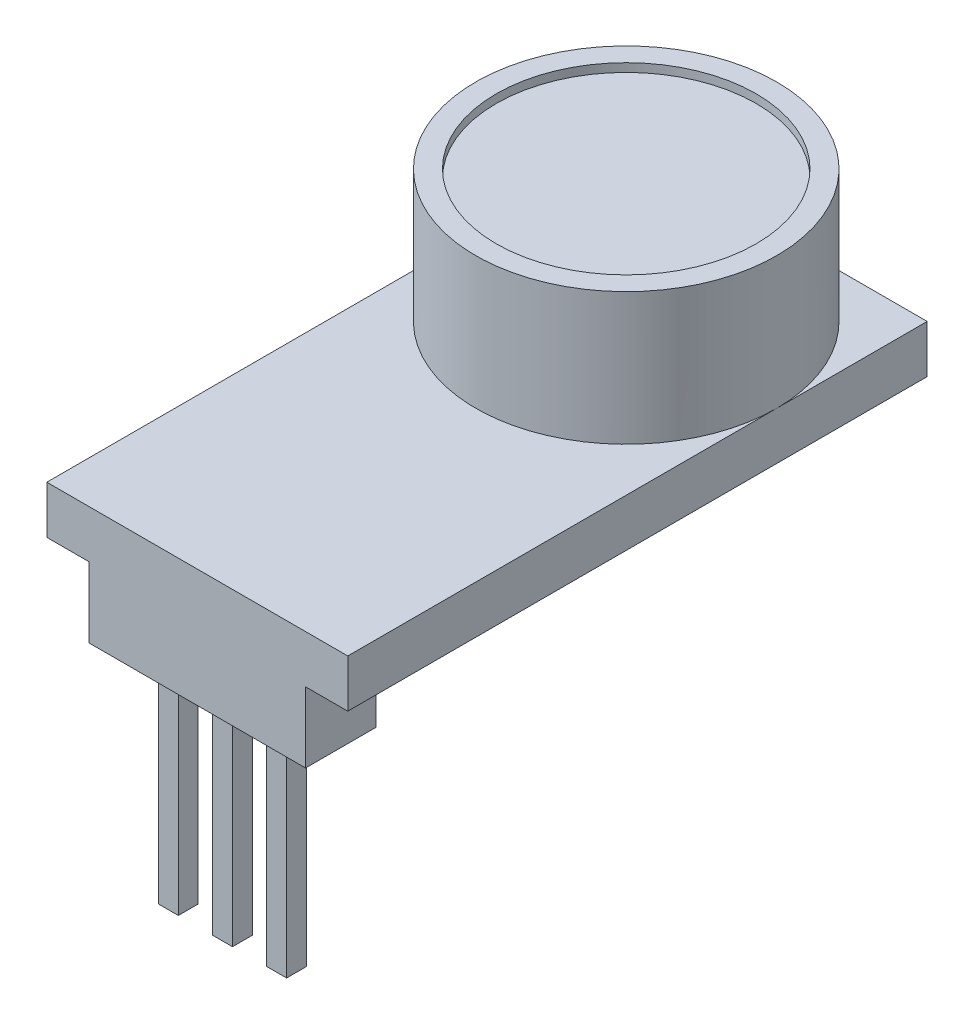
ISO-10303-21;
HEADER;
FILE_DESCRIPTION(('STEP AP214'),'2;1');
FILE_NAME('part.step','',(''),(''),'','','');
FILE_SCHEMA(('AUTOMOTIVE_DESIGN { 1 0 10303 214 1 1 1 1 }'));
ENDSEC;
DATA;
#1=APPLICATION_CONTEXT('core data for automotive mechanical design processes');
#2=APPLICATION_PROTOCOL_DEFINITION('international standard','automotive_design',2000,#1);
#3=PRODUCT_CONTEXT('',#1,'mechanical');
#4=PRODUCT('Part','Part','',(#3));
#5=PRODUCT_RELATED_PRODUCT_CATEGORY('part','',(#4));
#6=PRODUCT_DEFINITION_FORMATION('','',#4);
#7=PRODUCT_DEFINITION_CONTEXT('part definition',#1,'design');
#8=PRODUCT_DEFINITION('design','',#6,#7);
#9=PRODUCT_DEFINITION_SHAPE('','',#8);
#10=(LENGTH_UNIT() NAMED_UNIT(*) SI_UNIT(.MILLI.,.METRE.));
#11=(NAMED_UNIT(*) PLANE_ANGLE_UNIT() SI_UNIT($,.RADIAN.));
#12=(NAMED_UNIT(*) SI_UNIT($,.STERADIAN.) SOLID_ANGLE_UNIT());
#13=UNCERTAINTY_MEASURE_WITH_UNIT(LENGTH_MEASURE(1.E-05),#10,'distance_accuracy_value','');
#14=(GEOMETRIC_REPRESENTATION_CONTEXT(3) GLOBAL_UNCERTAINTY_ASSIGNED_CONTEXT((#13)) GLOBAL_UNIT_ASSIGNED_CONTEXT((#10,
#11,#12)) REPRESENTATION_CONTEXT('',''));
#15=CARTESIAN_POINT('',(0.,0.,0.));
#16=DIRECTION('',(0.,0.,1.));
#17=DIRECTION('',(1.,0.,0.));
#18=AXIS2_PLACEMENT_3D('',#15,#16,#17);
#19=CARTESIAN_POINT('',(0.,-3.35,0.));
#20=DIRECTION('',(0.,-1.,0.));
#21=DIRECTION('',(0.,0.,-1.));
#22=AXIS2_PLACEMENT_3D('',#19,#20,#21);
#23=PLANE('',#22);
#24=DIRECTION('',(0.,0.,-1.));
#25=VECTOR('',#24,1.);
#26=CARTESIAN_POINT('',(-3.85,-3.35,10.3));
#27=LINE('',#26,#25);
#28=CARTESIAN_POINT('',(-3.85,-3.35,10.3));
#29=VERTEX_POINT('',#28);
#30=CARTESIAN_POINT('',(-3.85,-3.35,7.8));
#31=VERTEX_POINT('',#30);
#32=EDGE_CURVE('E280',#29,#31,#27,.T.);
#33=ORIENTED_EDGE('',*,*,#32,.T.);
#34=DIRECTION('',(1.,0.,0.));
#35=VECTOR('',#34,1.);
#36=CARTESIAN_POINT('',(-3.85,-3.35,7.8));
#37=LINE('',#36,#35);
#38=CARTESIAN_POINT('',(3.85,-3.35,7.8));
#39=VERTEX_POINT('',#38);
#40=EDGE_CURVE('E283',#31,#39,#37,.T.);
#41=ORIENTED_EDGE('',*,*,#40,.T.);
#42=DIRECTION('',(0.,0.,1.));
#43=VECTOR('',#42,1.);
#44=CARTESIAN_POINT('',(3.85,-3.35,10.3));
#45=LINE('',#44,#43);
#46=CARTESIAN_POINT('',(3.85,-3.35,10.3));
#47=VERTEX_POINT('',#46);
#48=EDGE_CURVE('E286',#39,#47,#45,.T.);
#49=ORIENTED_EDGE('',*,*,#48,.T.);
#50=DIRECTION('',(-1.,0.,0.));
#51=VECTOR('',#50,1.);
#52=CARTESIAN_POINT('',(-3.85,-3.35,10.3));
#53=LINE('',#52,#51);
#54=EDGE_CURVE('E288',#47,#29,#53,.T.);
#55=ORIENTED_EDGE('',*,*,#54,.T.);
#56=EDGE_LOOP('',(#33,#41,#49,#55));
#57=FACE_BOUND('',#56,.T.);
#58=DIRECTION('',(-1.,0.,0.));
#59=VECTOR('',#58,1.);
#60=CARTESIAN_POINT('',(-2.27855339059327,-3.35,9.40355339059327));
#61=LINE('',#60,#59);
#62=CARTESIAN_POINT('',(-1.57144660940673,-3.35,9.40355339059327));
#63=VERTEX_POINT('',#62);
#64=CARTESIAN_POINT('',(-2.27855339059327,-3.35,9.40355339059327));
#65=VERTEX_POINT('',#64);
#66=EDGE_CURVE('E264',#63,#65,#61,.T.);
#67=ORIENTED_EDGE('',*,*,#66,.F.);
#68=DIRECTION('',(0.,0.,1.));
#69=VECTOR('',#68,1.);
#70=CARTESIAN_POINT('',(-1.57144660940673,-3.35,8.69644660940672));
#71=LINE('',#70,#69);
#72=CARTESIAN_POINT('',(-1.57144660940673,-3.35,8.69644660940672));
#73=VERTEX_POINT('',#72);
#74=EDGE_CURVE('E243',#73,#63,#71,.T.);
#75=ORIENTED_EDGE('',*,*,#74,.F.);
#76=DIRECTION('',(1.,0.,0.));
#77=VECTOR('',#76,1.);
#78=CARTESIAN_POINT('',(-2.27855339059327,-3.35,8.69644660940672));
#79=LINE('',#78,#77);
#80=CARTESIAN_POINT('',(-2.27855339059327,-3.35,8.69644660940672));
#81=VERTEX_POINT('',#80);
#82=EDGE_CURVE('E255',#81,#73,#79,.T.);
#83=ORIENTED_EDGE('',*,*,#82,.F.);
#84=DIRECTION('',(0.,0.,-1.));
#85=VECTOR('',#84,1.);
#86=CARTESIAN_POINT('',(-2.27855339059327,-3.35,8.69644660940672));
#87=LINE('',#86,#85);
#88=EDGE_CURVE('E266',#65,#81,#87,.T.);
#89=ORIENTED_EDGE('',*,*,#88,.F.);
#90=EDGE_LOOP('',(#67,#75,#83,#89));
#91=FACE_BOUND('',#90,.T.);
#92=DIRECTION('',(-1.,0.,0.));
#93=VECTOR('',#92,1.);
#94=CARTESIAN_POINT('',(-0.353553390593274,-3.35,9.40355339059327));
#95=LINE('',#94,#93);
#96=CARTESIAN_POINT('',(0.353553390593274,-3.35,9.40355339059327));
#97=VERTEX_POINT('',#96);
#98=CARTESIAN_POINT('',(-0.353553390593274,-3.35,9.40355339059327));
#99=VERTEX_POINT('',#98);
#100=EDGE_CURVE('E238',#97,#99,#95,.T.);
#101=ORIENTED_EDGE('',*,*,#100,.F.);
#102=DIRECTION('',(0.,0.,1.));
#103=VECTOR('',#102,1.);
#104=CARTESIAN_POINT('',(0.353553390593274,-3.35,8.69644660940672));
#105=LINE('',#104,#103);
#106=CARTESIAN_POINT('',(0.353553390593274,-3.35,8.69644660940672));
#107=VERTEX_POINT('',#106);
#108=EDGE_CURVE('E240',#107,#97,#105,.T.);
#109=ORIENTED_EDGE('',*,*,#108,.F.);
#110=DIRECTION('',(1.,0.,0.));
#111=VECTOR('',#110,1.);
#112=CARTESIAN_POINT('',(-0.353553390593274,-3.35,8.69644660940672));
#113=LINE('',#112,#111);
#114=CARTESIAN_POINT('',(-0.353553390593274,-3.35,8.69644660940672));
#115=VERTEX_POINT('',#114);
#116=EDGE_CURVE('E233',#115,#107,#113,.T.);
#117=ORIENTED_EDGE('',*,*,#116,.F.);
#118=DIRECTION('',(0.,0.,-1.));
#119=VECTOR('',#118,1.);
#120=CARTESIAN_POINT('',(-0.353553390593274,-3.35,8.69644660940672));
#121=LINE('',#120,#119);
#122=EDGE_CURVE('E235',#99,#115,#121,.T.);
#123=ORIENTED_EDGE('',*,*,#122,.F.);
#124=EDGE_LOOP('',(#101,#109,#117,#123));
#125=FACE_BOUND('',#124,.T.);
#126=DIRECTION('',(-1.,0.,0.));
#127=VECTOR('',#126,1.);
#128=CARTESIAN_POINT('',(1.57144660940673,-3.35,9.40355339059327));
#129=LINE('',#128,#127);
#130=CARTESIAN_POINT('',(2.27855339059327,-3.35,9.40355339059327));
#131=VERTEX_POINT('',#130);
#132=CARTESIAN_POINT('',(1.57144660940673,-3.35,9.40355339059327));
#133=VERTEX_POINT('',#132);
#134=EDGE_CURVE('E212',#131,#133,#129,.T.);
#135=ORIENTED_EDGE('',*,*,#134,.F.);
#136=DIRECTION('',(0.,0.,1.));
#137=VECTOR('',#136,1.);
#138=CARTESIAN_POINT('',(2.27855339059327,-3.35,8.69644660940672));
#139=LINE('',#138,#137);
#140=CARTESIAN_POINT('',(2.27855339059327,-3.35,8.69644660940672));
#141=VERTEX_POINT('',#140);
#142=EDGE_CURVE('E207',#141,#131,#139,.T.);
#143=ORIENTED_EDGE('',*,*,#142,.F.);
#144=DIRECTION('',(1.,0.,0.));
#145=VECTOR('',#144,1.);
#146=CARTESIAN_POINT('',(1.57144660940673,-3.35,8.69644660940672));
#147=LINE('',#146,#145);
#148=CARTESIAN_POINT('',(1.57144660940673,-3.35,8.69644660940672));
#149=VERTEX_POINT('',#148);
#150=EDGE_CURVE('E192',#149,#141,#147,.T.);
#151=ORIENTED_EDGE('',*,*,#150,.F.);
#152=DIRECTION('',(0.,0.,-1.));
#153=VECTOR('',#152,1.);
#154=CARTESIAN_POINT('',(1.57144660940673,-3.35,8.69644660940672));
#155=LINE('',#154,#153);
#156=EDGE_CURVE('E200',#133,#149,#155,.T.);
#157=ORIENTED_EDGE('',*,*,#156,.F.);
#158=EDGE_LOOP('',(#135,#143,#151,#157));
#159=FACE_BOUND('',#158,.T.);
#160=ADVANCED_FACE('F45',(#57,#91,#125,#159),#23,.T.);
#161=CARTESIAN_POINT('',(0.,0.85,0.));
#162=DIRECTION('',(0.,-1.,0.));
#163=DIRECTION('',(0.,0.,-1.));
#164=AXIS2_PLACEMENT_3D('',#161,#162,#163);
#165=PLANE('',#164);
#166=DIRECTION('',(-1.,0.,0.));
#167=VECTOR('',#166,1.);
#168=CARTESIAN_POINT('',(-5.35,0.85,-10.3));
#169=LINE('',#168,#167);
#170=CARTESIAN_POINT('',(5.35,0.85,-10.3));
#171=VERTEX_POINT('',#170);
#172=CARTESIAN_POINT('',(0.,0.85,-10.3));
#173=VERTEX_POINT('',#172);
#174=EDGE_CURVE('E322',#171,#173,#169,.T.);
#175=ORIENTED_EDGE('',*,*,#174,.T.);
#176=CARTESIAN_POINT('',(0.,0.85,-4.95));
#177=DIRECTION('',(0.,-1.,0.));
#178=DIRECTION('',(0.,0.,-1.));
#179=AXIS2_PLACEMENT_3D('',#176,#177,#178);
#180=CIRCLE('',#179,5.35);
#181=CARTESIAN_POINT('',(5.35,0.85,-4.95));
#182=VERTEX_POINT('',#181);
#183=EDGE_CURVE('E316',#173,#182,#180,.T.);
#184=ORIENTED_EDGE('',*,*,#183,.T.);
#185=DIRECTION('',(0.,0.,-1.));
#186=VECTOR('',#185,1.);
#187=CARTESIAN_POINT('',(5.35,0.85,10.3));
#188=LINE('',#187,#186);
#189=EDGE_CURVE('E321',#182,#171,#188,.T.);
#190=ORIENTED_EDGE('',*,*,#189,.T.);
#191=EDGE_LOOP('',(#175,#184,#190));
#192=FACE_BOUND('',#191,.T.);
#193=ADVANCED_FACE('F391',(#192),#165,.F.);
#194=CARTESIAN_POINT('',(5.35,0.85,10.3));
#195=VERTEX_POINT('',#194);
#196=EDGE_CURVE('E317',#195,#182,#188,.T.);
#197=ORIENTED_EDGE('',*,*,#196,.T.);
#198=CARTESIAN_POINT('',(-5.35,0.85,-4.95));
#199=VERTEX_POINT('',#198);
#200=EDGE_CURVE('E315',#182,#199,#180,.T.);
#201=ORIENTED_EDGE('',*,*,#200,.T.);
#202=DIRECTION('',(0.,0.,1.));
#203=VECTOR('',#202,1.);
#204=CARTESIAN_POINT('',(-5.35,0.85,10.3));
#205=LINE('',#204,#203);
#206=CARTESIAN_POINT('',(-5.35,0.85,10.3));
#207=VERTEX_POINT('',#206);
#208=EDGE_CURVE('E325',#199,#207,#205,.T.);
#209=ORIENTED_EDGE('',*,*,#208,.T.);
#210=DIRECTION('',(1.,0.,0.));
#211=VECTOR('',#210,1.);
#212=CARTESIAN_POINT('',(-5.35,0.85,10.3));
#213=LINE('',#212,#211);
#214=EDGE_CURVE('E329',#207,#195,#213,.T.);
#215=ORIENTED_EDGE('',*,*,#214,.T.);
#216=EDGE_LOOP('',(#197,#201,#209,#215));
#217=FACE_BOUND('',#216,.T.);
#218=ADVANCED_FACE('F396',(#217),#165,.F.);
#219=CARTESIAN_POINT('',(5.35,0.85,10.3));
#220=DIRECTION('',(-1.,0.,0.));
#221=DIRECTION('',(0.,0.,1.));
#222=AXIS2_PLACEMENT_3D('',#219,#220,#221);
#223=PLANE('',#222);
#224=ORIENTED_EDGE('',*,*,#189,.F.);
#225=ORIENTED_EDGE('',*,*,#196,.F.);
#226=DIRECTION('',(0.,-1.,0.));
#227=VECTOR('',#226,1.);
#228=CARTESIAN_POINT('',(5.35,0.85,10.3));
#229=LINE('',#228,#227);
#230=CARTESIAN_POINT('',(5.35,-0.85,10.3));
#231=VERTEX_POINT('',#230);
#232=EDGE_CURVE('E331',#195,#231,#229,.T.);
#233=ORIENTED_EDGE('',*,*,#232,.T.);
#234=DIRECTION('',(0.,0.,-1.));
#235=VECTOR('',#234,1.);
#236=CARTESIAN_POINT('',(5.35,-0.85,10.3));
#237=LINE('',#236,#235);
#238=CARTESIAN_POINT('',(5.35,-0.85,-10.3));
#239=VERTEX_POINT('',#238);
#240=EDGE_CURVE('E332',#231,#239,#237,.T.);
#241=ORIENTED_EDGE('',*,*,#240,.T.);
#242=DIRECTION('',(0.,-1.,0.));
#243=VECTOR('',#242,1.);
#244=CARTESIAN_POINT('',(5.35,0.85,-10.3));
#245=LINE('',#244,#243);
#246=EDGE_CURVE('E11',#171,#239,#245,.T.);
#247=ORIENTED_EDGE('',*,*,#246,.F.);
#248=EDGE_LOOP('',(#224,#225,#233,#241,#247));
#249=FACE_BOUND('',#248,.T.);
#250=ADVANCED_FACE('F47',(#249),#223,.F.);
#251=CARTESIAN_POINT('',(-5.35,0.85,-10.3));
#252=DIRECTION('',(0.,0.,1.));
#253=DIRECTION('',(1.,0.,0.));
#254=AXIS2_PLACEMENT_3D('',#251,#252,#253);
#255=PLANE('',#254);
#256=CARTESIAN_POINT('',(-5.35,0.85,-10.3));
#257=VERTEX_POINT('',#256);
#258=EDGE_CURVE('E320',#173,#257,#169,.T.);
#259=ORIENTED_EDGE('',*,*,#258,.F.);
#260=ORIENTED_EDGE('',*,*,#174,.F.);
#261=ORIENTED_EDGE('',*,*,#246,.T.);
#262=DIRECTION('',(-1.,0.,0.));
#263=VECTOR('',#262,1.);
#264=CARTESIAN_POINT('',(-5.35,-0.85,-10.3));
#265=LINE('',#264,#263);
#266=CARTESIAN_POINT('',(-5.35,-0.85,-10.3));
#267=VERTEX_POINT('',#266);
#268=EDGE_CURVE('E334',#239,#267,#265,.T.);
#269=ORIENTED_EDGE('',*,*,#268,.T.);
#270=DIRECTION('',(0.,-1.,0.));
#271=VECTOR('',#270,1.);
#272=CARTESIAN_POINT('',(-5.35,0.85,-10.3));
#273=LINE('',#272,#271);
#274=EDGE_CURVE('E53',#257,#267,#273,.T.);
#275=ORIENTED_EDGE('',*,*,#274,.F.);
#276=EDGE_LOOP('',(#259,#260,#261,#269,#275));
#277=FACE_BOUND('',#276,.T.);
#278=ADVANCED_FACE('F496',(#277),#255,.F.);
#279=CARTESIAN_POINT('',(-5.35,0.85,10.3));
#280=DIRECTION('',(1.,0.,0.));
#281=DIRECTION('',(0.,0.,-1.));
#282=AXIS2_PLACEMENT_3D('',#279,#280,#281);
#283=PLANE('',#282);
#284=ORIENTED_EDGE('',*,*,#208,.F.);
#285=EDGE_CURVE('E326',#257,#199,#205,.T.);
#286=ORIENTED_EDGE('',*,*,#285,.F.);
#287=ORIENTED_EDGE('',*,*,#274,.T.);
#288=DIRECTION('',(0.,0.,1.));
#289=VECTOR('',#288,1.);
#290=CARTESIAN_POINT('',(-5.35,-0.85,10.3));
#291=LINE('',#290,#289);
#292=CARTESIAN_POINT('',(-5.35,-0.85,10.3));
#293=VERTEX_POINT('',#292);
#294=EDGE_CURVE('E336',#267,#293,#291,.T.);
#295=ORIENTED_EDGE('',*,*,#294,.T.);
#296=DIRECTION('',(0.,-1.,0.));
#297=VECTOR('',#296,1.);
#298=CARTESIAN_POINT('',(-5.35,0.85,10.3));
#299=LINE('',#298,#297);
#300=EDGE_CURVE('E344',#207,#293,#299,.T.);
#301=ORIENTED_EDGE('',*,*,#300,.F.);
#302=EDGE_LOOP('',(#284,#286,#287,#295,#301));
#303=FACE_BOUND('',#302,.T.);
#304=ADVANCED_FACE('F352',(#303),#283,.F.);
#305=CARTESIAN_POINT('',(-5.35,0.85,10.3));
#306=DIRECTION('',(0.,0.,-1.));
#307=DIRECTION('',(-1.,0.,0.));
#308=AXIS2_PLACEMENT_3D('',#305,#306,#307);
#309=PLANE('',#308);
#310=DIRECTION('',(1.,0.,0.));
#311=VECTOR('',#310,1.);
#312=CARTESIAN_POINT('',(-5.35,-0.85,10.3));
#313=LINE('',#312,#311);
#314=CARTESIAN_POINT('',(-3.85,-0.85,10.3));
#315=VERTEX_POINT('',#314);
#316=EDGE_CURVE('E339',#293,#315,#313,.T.);
#317=ORIENTED_EDGE('',*,*,#316,.T.);
#318=DIRECTION('',(0.,1.,0.));
#319=VECTOR('',#318,1.);
#320=CARTESIAN_POINT('',(-3.85,-3.35,10.3));
#321=LINE('',#320,#319);
#322=EDGE_CURVE('E290',#29,#315,#321,.T.);
#323=ORIENTED_EDGE('',*,*,#322,.F.);
#324=ORIENTED_EDGE('',*,*,#54,.F.);
#325=DIRECTION('',(0.,1.,0.));
#326=VECTOR('',#325,1.);
#327=CARTESIAN_POINT('',(3.85,-3.35,10.3));
#328=LINE('',#327,#326);
#329=CARTESIAN_POINT('',(3.85,-0.85,10.3));
#330=VERTEX_POINT('',#329);
#331=EDGE_CURVE('E300',#47,#330,#328,.T.);
#332=ORIENTED_EDGE('',*,*,#331,.T.);
#333=EDGE_CURVE('E338',#330,#231,#313,.T.);
#334=ORIENTED_EDGE('',*,*,#333,.T.);
#335=ORIENTED_EDGE('',*,*,#232,.F.);
#336=ORIENTED_EDGE('',*,*,#214,.F.);
#337=ORIENTED_EDGE('',*,*,#300,.T.);
#338=EDGE_LOOP('',(#317,#323,#324,#332,#334,#335,#336,#337));
#339=FACE_BOUND('',#338,.T.);
#340=ADVANCED_FACE('F363',(#339),#309,.F.);
#341=ORIENTED_EDGE('',*,*,#285,.T.);
#342=EDGE_CURVE('E312',#199,#173,#180,.T.);
#343=ORIENTED_EDGE('',*,*,#342,.T.);
#344=ORIENTED_EDGE('',*,*,#258,.T.);
#345=EDGE_LOOP('',(#341,#343,#344));
#346=FACE_BOUND('',#345,.T.);
#347=ADVANCED_FACE('F399',(#346),#165,.F.);
#348=CARTESIAN_POINT('',(0.,-0.85,0.));
#349=DIRECTION('',(0.,-1.,0.));
#350=DIRECTION('',(0.,0.,-1.));
#351=AXIS2_PLACEMENT_3D('',#348,#349,#350);
#352=PLANE('',#351);
#353=DIRECTION('',(0.,0.,-1.));
#354=VECTOR('',#353,1.);
#355=CARTESIAN_POINT('',(-3.85,-0.85,10.3));
#356=LINE('',#355,#354);
#357=CARTESIAN_POINT('',(-3.85,-0.85,7.8));
#358=VERTEX_POINT('',#357);
#359=EDGE_CURVE('E279',#315,#358,#356,.T.);
#360=ORIENTED_EDGE('',*,*,#359,.F.);
#361=ORIENTED_EDGE('',*,*,#316,.F.);
#362=ORIENTED_EDGE('',*,*,#294,.F.);
#363=ORIENTED_EDGE('',*,*,#268,.F.);
#364=ORIENTED_EDGE('',*,*,#240,.F.);
#365=ORIENTED_EDGE('',*,*,#333,.F.);
#366=DIRECTION('',(0.,0.,1.));
#367=VECTOR('',#366,1.);
#368=CARTESIAN_POINT('',(3.85,-0.85,10.3));
#369=LINE('',#368,#367);
#370=CARTESIAN_POINT('',(3.85,-0.85,7.8));
#371=VERTEX_POINT('',#370);
#372=EDGE_CURVE('E284',#371,#330,#369,.T.);
#373=ORIENTED_EDGE('',*,*,#372,.F.);
#374=DIRECTION('',(1.,0.,0.));
#375=VECTOR('',#374,1.);
#376=CARTESIAN_POINT('',(-3.85,-0.85,7.8));
#377=LINE('',#376,#375);
#378=EDGE_CURVE('E293',#358,#371,#377,.T.);
#379=ORIENTED_EDGE('',*,*,#378,.F.);
#380=EDGE_LOOP('',(#360,#361,#362,#363,#364,#365,#373,#379));
#381=FACE_BOUND('',#380,.T.);
#382=ADVANCED_FACE('F359',(#381),#352,.T.);
#383=CARTESIAN_POINT('',(0.,5.55,-4.95));
#384=DIRECTION('',(0.,-1.,0.));
#385=DIRECTION('',(0.,0.,-1.));
#386=AXIS2_PLACEMENT_3D('',#383,#384,#385);
#387=CYLINDRICAL_SURFACE('',#386,5.35);
#388=CARTESIAN_POINT('',(0.,5.55,-4.95));
#389=DIRECTION('',(0.,-1.,0.));
#390=DIRECTION('',(0.,0.,-1.));
#391=AXIS2_PLACEMENT_3D('',#388,#389,#390);
#392=CIRCLE('',#391,5.35);
#393=CARTESIAN_POINT('',(0.,5.55,-10.3));
#394=VERTEX_POINT('',#393);
#395=EDGE_CURVE('E309',#394,#394,#392,.T.);
#396=ORIENTED_EDGE('',*,*,#395,.T.);
#397=EDGE_LOOP('',(#396));
#398=FACE_BOUND('',#397,.T.);
#399=ORIENTED_EDGE('',*,*,#183,.F.);
#400=ORIENTED_EDGE('',*,*,#342,.F.);
#401=ORIENTED_EDGE('',*,*,#200,.F.);
#402=EDGE_LOOP('',(#399,#400,#401));
#403=FACE_BOUND('',#402,.T.);
#404=ADVANCED_FACE('F484',(#398,#403),#387,.T.);
#405=CARTESIAN_POINT('',(0.,5.55,-4.95));
#406=DIRECTION('',(0.,-1.,0.));
#407=DIRECTION('',(0.,0.,-1.));
#408=AXIS2_PLACEMENT_3D('',#405,#406,#407);
#409=PLANE('',#408);
#410=CARTESIAN_POINT('',(0.,5.55,-4.95));
#411=DIRECTION('',(0.,1.,0.));
#412=DIRECTION('',(0.,0.,1.));
#413=AXIS2_PLACEMENT_3D('',#410,#411,#412);
#414=CIRCLE('',#413,4.62094010083707);
#415=CARTESIAN_POINT('',(0.,5.55,-0.329059899162931));
#416=VERTEX_POINT('',#415);
#417=EDGE_CURVE('E468',#416,#416,#414,.T.);
#418=ORIENTED_EDGE('',*,*,#417,.F.);
#419=EDGE_LOOP('',(#418));
#420=FACE_BOUND('',#419,.T.);
#421=ORIENTED_EDGE('',*,*,#395,.F.);
#422=EDGE_LOOP('',(#421));
#423=FACE_BOUND('',#422,.T.);
#424=ADVANCED_FACE('F388',(#420,#423),#409,.F.);
#425=CARTESIAN_POINT('',(-3.85,-3.35,10.3));
#426=DIRECTION('',(1.,0.,0.));
#427=DIRECTION('',(0.,0.,-1.));
#428=AXIS2_PLACEMENT_3D('',#425,#426,#427);
#429=PLANE('',#428);
#430=ORIENTED_EDGE('',*,*,#359,.T.);
#431=DIRECTION('',(0.,1.,0.));
#432=VECTOR('',#431,1.);
#433=CARTESIAN_POINT('',(-3.85,-3.35,7.8));
#434=LINE('',#433,#432);
#435=EDGE_CURVE('E306',#31,#358,#434,.T.);
#436=ORIENTED_EDGE('',*,*,#435,.F.);
#437=ORIENTED_EDGE('',*,*,#32,.F.);
#438=ORIENTED_EDGE('',*,*,#322,.T.);
#439=EDGE_LOOP('',(#430,#436,#437,#438));
#440=FACE_BOUND('',#439,.T.);
#441=ADVANCED_FACE('F368',(#440),#429,.F.);
#442=CARTESIAN_POINT('',(-3.85,-3.35,7.8));
#443=DIRECTION('',(0.,0.,1.));
#444=DIRECTION('',(1.,0.,0.));
#445=AXIS2_PLACEMENT_3D('',#442,#443,#444);
#446=PLANE('',#445);
#447=ORIENTED_EDGE('',*,*,#378,.T.);
#448=DIRECTION('',(0.,1.,0.));
#449=VECTOR('',#448,1.);
#450=CARTESIAN_POINT('',(3.85,-3.35,7.8));
#451=LINE('',#450,#449);
#452=EDGE_CURVE('E303',#39,#371,#451,.T.);
#453=ORIENTED_EDGE('',*,*,#452,.F.);
#454=ORIENTED_EDGE('',*,*,#40,.F.);
#455=ORIENTED_EDGE('',*,*,#435,.T.);
#456=EDGE_LOOP('',(#447,#453,#454,#455));
#457=FACE_BOUND('',#456,.T.);
#458=ADVANCED_FACE('F379',(#457),#446,.F.);
#459=CARTESIAN_POINT('',(3.85,-3.35,10.3));
#460=DIRECTION('',(-1.,0.,0.));
#461=DIRECTION('',(0.,0.,1.));
#462=AXIS2_PLACEMENT_3D('',#459,#460,#461);
#463=PLANE('',#462);
#464=ORIENTED_EDGE('',*,*,#372,.T.);
#465=ORIENTED_EDGE('',*,*,#331,.F.);
#466=ORIENTED_EDGE('',*,*,#48,.F.);
#467=ORIENTED_EDGE('',*,*,#452,.T.);
#468=EDGE_LOOP('',(#464,#465,#466,#467));
#469=FACE_BOUND('',#468,.T.);
#470=ADVANCED_FACE('F377',(#469),#463,.F.);
#471=CARTESIAN_POINT('',(-1.57144660940673,-11.05,8.69644660940672));
#472=DIRECTION('',(-1.,0.,0.));
#473=DIRECTION('',(0.,0.,1.));
#474=AXIS2_PLACEMENT_3D('',#471,#472,#473);
#475=PLANE('',#474);
#476=ORIENTED_EDGE('',*,*,#74,.T.);
#477=DIRECTION('',(0.,1.,0.));
#478=VECTOR('',#477,1.);
#479=CARTESIAN_POINT('',(-1.57144660940673,-11.05,9.40355339059327));
#480=LINE('',#479,#478);
#481=CARTESIAN_POINT('',(-1.57144660940673,-11.05,9.40355339059327));
#482=VERTEX_POINT('',#481);
#483=EDGE_CURVE('E277',#482,#63,#480,.T.);
#484=ORIENTED_EDGE('',*,*,#483,.F.);
#485=DIRECTION('',(0.,0.,1.));
#486=VECTOR('',#485,1.);
#487=CARTESIAN_POINT('',(-1.57144660940673,-11.05,8.69644660940672));
#488=LINE('',#487,#486);
#489=CARTESIAN_POINT('',(-1.57144660940673,-11.05,8.69644660940672));
#490=VERTEX_POINT('',#489);
#491=EDGE_CURVE('E251',#490,#482,#488,.T.);
#492=ORIENTED_EDGE('',*,*,#491,.F.);
#493=DIRECTION('',(0.,1.,0.));
#494=VECTOR('',#493,1.);
#495=CARTESIAN_POINT('',(-1.57144660940673,-11.05,8.69644660940672));
#496=LINE('',#495,#494);
#497=EDGE_CURVE('E261',#490,#73,#496,.T.);
#498=ORIENTED_EDGE('',*,*,#497,.T.);
#499=EDGE_LOOP('',(#476,#484,#492,#498));
#500=FACE_BOUND('',#499,.T.);
#501=ADVANCED_FACE('F386',(#500),#475,.F.);
#502=CARTESIAN_POINT('',(-2.27855339059327,-11.05,9.40355339059327));
#503=DIRECTION('',(0.,0.,-1.));
#504=DIRECTION('',(-1.,0.,0.));
#505=AXIS2_PLACEMENT_3D('',#502,#503,#504);
#506=PLANE('',#505);
#507=ORIENTED_EDGE('',*,*,#66,.T.);
#508=DIRECTION('',(0.,1.,0.));
#509=VECTOR('',#508,1.);
#510=CARTESIAN_POINT('',(-2.27855339059327,-11.05,9.40355339059327));
#511=LINE('',#510,#509);
#512=CARTESIAN_POINT('',(-2.27855339059327,-11.05,9.40355339059327));
#513=VERTEX_POINT('',#512);
#514=EDGE_CURVE('E274',#513,#65,#511,.T.);
#515=ORIENTED_EDGE('',*,*,#514,.F.);
#516=DIRECTION('',(-1.,0.,0.));
#517=VECTOR('',#516,1.);
#518=CARTESIAN_POINT('',(-2.27855339059327,-11.05,9.40355339059327));
#519=LINE('',#518,#517);
#520=EDGE_CURVE('E254',#482,#513,#519,.T.);
#521=ORIENTED_EDGE('',*,*,#520,.F.);
#522=ORIENTED_EDGE('',*,*,#483,.T.);
#523=EDGE_LOOP('',(#507,#515,#521,#522));
#524=FACE_BOUND('',#523,.T.);
#525=ADVANCED_FACE('F403',(#524),#506,.F.);
#526=CARTESIAN_POINT('',(-2.27855339059327,-11.05,8.69644660940672));
#527=DIRECTION('',(1.,0.,0.));
#528=DIRECTION('',(0.,0.,-1.));
#529=AXIS2_PLACEMENT_3D('',#526,#527,#528);
#530=PLANE('',#529);
#531=ORIENTED_EDGE('',*,*,#88,.T.);
#532=DIRECTION('',(0.,1.,0.));
#533=VECTOR('',#532,1.);
#534=CARTESIAN_POINT('',(-2.27855339059327,-11.05,8.69644660940672));
#535=LINE('',#534,#533);
#536=CARTESIAN_POINT('',(-2.27855339059327,-11.05,8.69644660940672));
#537=VERTEX_POINT('',#536);
#538=EDGE_CURVE('E272',#537,#81,#535,.T.);
#539=ORIENTED_EDGE('',*,*,#538,.F.);
#540=DIRECTION('',(0.,0.,-1.));
#541=VECTOR('',#540,1.);
#542=CARTESIAN_POINT('',(-2.27855339059327,-11.05,8.69644660940672));
#543=LINE('',#542,#541);
#544=EDGE_CURVE('E257',#513,#537,#543,.T.);
#545=ORIENTED_EDGE('',*,*,#544,.F.);
#546=ORIENTED_EDGE('',*,*,#514,.T.);
#547=EDGE_LOOP('',(#531,#539,#545,#546));
#548=FACE_BOUND('',#547,.T.);
#549=ADVANCED_FACE('F407',(#548),#530,.F.);
#550=CARTESIAN_POINT('',(-2.27855339059327,-11.05,8.69644660940672));
#551=DIRECTION('',(0.,0.,1.));
#552=DIRECTION('',(1.,0.,0.));
#553=AXIS2_PLACEMENT_3D('',#550,#551,#552);
#554=PLANE('',#553);
#555=ORIENTED_EDGE('',*,*,#82,.T.);
#556=ORIENTED_EDGE('',*,*,#497,.F.);
#557=DIRECTION('',(1.,0.,0.));
#558=VECTOR('',#557,1.);
#559=CARTESIAN_POINT('',(-2.27855339059327,-11.05,8.69644660940672));
#560=LINE('',#559,#558);
#561=EDGE_CURVE('E259',#537,#490,#560,.T.);
#562=ORIENTED_EDGE('',*,*,#561,.F.);
#563=ORIENTED_EDGE('',*,*,#538,.T.);
#564=EDGE_LOOP('',(#555,#556,#562,#563));
#565=FACE_BOUND('',#564,.T.);
#566=ADVANCED_FACE('F411',(#565),#554,.F.);
#567=CARTESIAN_POINT('',(0.,-11.05,0.));
#568=DIRECTION('',(0.,1.,0.));
#569=DIRECTION('',(0.,0.,1.));
#570=AXIS2_PLACEMENT_3D('',#567,#568,#569);
#571=PLANE('',#570);
#572=ORIENTED_EDGE('',*,*,#491,.T.);
#573=ORIENTED_EDGE('',*,*,#520,.T.);
#574=ORIENTED_EDGE('',*,*,#544,.T.);
#575=ORIENTED_EDGE('',*,*,#561,.T.);
#576=EDGE_LOOP('',(#572,#573,#574,#575));
#577=FACE_BOUND('',#576,.T.);
#578=ADVANCED_FACE('F415',(#577),#571,.F.);
#579=CARTESIAN_POINT('',(0.353553390593274,-11.05,8.69644660940672));
#580=DIRECTION('',(-1.,0.,0.));
#581=DIRECTION('',(0.,0.,1.));
#582=AXIS2_PLACEMENT_3D('',#579,#580,#581);
#583=PLANE('',#582);
#584=ORIENTED_EDGE('',*,*,#108,.T.);
#585=DIRECTION('',(0.,1.,0.));
#586=VECTOR('',#585,1.);
#587=CARTESIAN_POINT('',(0.353553390593274,-11.05,9.40355339059327));
#588=LINE('',#587,#586);
#589=CARTESIAN_POINT('',(0.353553390593274,-11.05,9.40355339059327));
#590=VERTEX_POINT('',#589);
#591=EDGE_CURVE('E213',#590,#97,#588,.T.);
#592=ORIENTED_EDGE('',*,*,#591,.F.);
#593=DIRECTION('',(0.,0.,1.));
#594=VECTOR('',#593,1.);
#595=CARTESIAN_POINT('',(0.353553390593274,-11.05,8.69644660940672));
#596=LINE('',#595,#594);
#597=CARTESIAN_POINT('',(0.353553390593274,-11.05,8.69644660940672));
#598=VERTEX_POINT('',#597);
#599=EDGE_CURVE('E236',#598,#590,#596,.T.);
#600=ORIENTED_EDGE('',*,*,#599,.F.);
#601=DIRECTION('',(0.,1.,0.));
#602=VECTOR('',#601,1.);
#603=CARTESIAN_POINT('',(0.353553390593274,-11.05,8.69644660940672));
#604=LINE('',#603,#602);
#605=EDGE_CURVE('E229',#598,#107,#604,.T.);
#606=ORIENTED_EDGE('',*,*,#605,.T.);
#607=EDGE_LOOP('',(#584,#592,#600,#606));
#608=FACE_BOUND('',#607,.T.);
#609=ADVANCED_FACE('F419',(#608),#583,.F.);
#610=CARTESIAN_POINT('',(-0.353553390593274,-11.05,9.40355339059327));
#611=DIRECTION('',(0.,0.,-1.));
#612=DIRECTION('',(-1.,0.,0.));
#613=AXIS2_PLACEMENT_3D('',#610,#611,#612);
#614=PLANE('',#613);
#615=ORIENTED_EDGE('',*,*,#100,.T.);
#616=DIRECTION('',(0.,1.,0.));
#617=VECTOR('',#616,1.);
#618=CARTESIAN_POINT('',(-0.353553390593274,-11.05,9.40355339059327));
#619=LINE('',#618,#617);
#620=CARTESIAN_POINT('',(-0.353553390593274,-11.05,9.40355339059327));
#621=VERTEX_POINT('',#620);
#622=EDGE_CURVE('E215',#621,#99,#619,.T.);
#623=ORIENTED_EDGE('',*,*,#622,.F.);
#624=DIRECTION('',(-1.,0.,0.));
#625=VECTOR('',#624,1.);
#626=CARTESIAN_POINT('',(-0.353553390593274,-11.05,9.40355339059327));
#627=LINE('',#626,#625);
#628=EDGE_CURVE('E247',#590,#621,#627,.T.);
#629=ORIENTED_EDGE('',*,*,#628,.F.);
#630=ORIENTED_EDGE('',*,*,#591,.T.);
#631=EDGE_LOOP('',(#615,#623,#629,#630));
#632=FACE_BOUND('',#631,.T.);
#633=ADVANCED_FACE('F431',(#632),#614,.F.);
#634=CARTESIAN_POINT('',(-0.353553390593274,-11.05,8.69644660940672));
#635=DIRECTION('',(1.,0.,0.));
#636=DIRECTION('',(0.,0.,-1.));
#637=AXIS2_PLACEMENT_3D('',#634,#635,#636);
#638=PLANE('',#637);
#639=ORIENTED_EDGE('',*,*,#122,.T.);
#640=DIRECTION('',(0.,1.,0.));
#641=VECTOR('',#640,1.);
#642=CARTESIAN_POINT('',(-0.353553390593274,-11.05,8.69644660940672));
#643=LINE('',#642,#641);
#644=CARTESIAN_POINT('',(-0.353553390593274,-11.05,8.69644660940672));
#645=VERTEX_POINT('',#644);
#646=EDGE_CURVE('E68',#645,#115,#643,.T.);
#647=ORIENTED_EDGE('',*,*,#646,.F.);
#648=DIRECTION('',(0.,0.,-1.));
#649=VECTOR('',#648,1.);
#650=CARTESIAN_POINT('',(-0.353553390593274,-11.05,8.69644660940672));
#651=LINE('',#650,#649);
#652=EDGE_CURVE('E245',#621,#645,#651,.T.);
#653=ORIENTED_EDGE('',*,*,#652,.F.);
#654=ORIENTED_EDGE('',*,*,#622,.T.);
#655=EDGE_LOOP('',(#639,#647,#653,#654));
#656=FACE_BOUND('',#655,.T.);
#657=ADVANCED_FACE('F428',(#656),#638,.F.);
#658=CARTESIAN_POINT('',(-0.353553390593274,-11.05,8.69644660940672));
#659=DIRECTION('',(0.,0.,1.));
#660=DIRECTION('',(1.,0.,0.));
#661=AXIS2_PLACEMENT_3D('',#658,#659,#660);
#662=PLANE('',#661);
#663=ORIENTED_EDGE('',*,*,#116,.T.);
#664=ORIENTED_EDGE('',*,*,#605,.F.);
#665=DIRECTION('',(1.,0.,0.));
#666=VECTOR('',#665,1.);
#667=CARTESIAN_POINT('',(-0.353553390593274,-11.05,8.69644660940672));
#668=LINE('',#667,#666);
#669=EDGE_CURVE('E232',#645,#598,#668,.T.);
#670=ORIENTED_EDGE('',*,*,#669,.F.);
#671=ORIENTED_EDGE('',*,*,#646,.T.);
#672=EDGE_LOOP('',(#663,#664,#670,#671));
#673=FACE_BOUND('',#672,.T.);
#674=ADVANCED_FACE('F424',(#673),#662,.F.);
#675=CARTESIAN_POINT('',(0.,-11.05,0.));
#676=DIRECTION('',(0.,1.,0.));
#677=DIRECTION('',(0.,0.,1.));
#678=AXIS2_PLACEMENT_3D('',#675,#676,#677);
#679=PLANE('',#678);
#680=ORIENTED_EDGE('',*,*,#599,.T.);
#681=ORIENTED_EDGE('',*,*,#628,.T.);
#682=ORIENTED_EDGE('',*,*,#652,.T.);
#683=ORIENTED_EDGE('',*,*,#669,.T.);
#684=EDGE_LOOP('',(#680,#681,#682,#683));
#685=FACE_BOUND('',#684,.T.);
#686=ADVANCED_FACE('F421',(#685),#679,.F.);
#687=CARTESIAN_POINT('',(2.27855339059327,-11.05,8.69644660940672));
#688=DIRECTION('',(-1.,0.,0.));
#689=DIRECTION('',(0.,0.,1.));
#690=AXIS2_PLACEMENT_3D('',#687,#688,#689);
#691=PLANE('',#690);
#692=ORIENTED_EDGE('',*,*,#142,.T.);
#693=DIRECTION('',(0.,1.,0.));
#694=VECTOR('',#693,1.);
#695=CARTESIAN_POINT('',(2.27855339059327,-11.05,9.40355339059327));
#696=LINE('',#695,#694);
#697=CARTESIAN_POINT('',(2.27855339059327,-11.05,9.40355339059327));
#698=VERTEX_POINT('',#697);
#699=EDGE_CURVE('E467',#698,#131,#696,.T.);
#700=ORIENTED_EDGE('',*,*,#699,.F.);
#701=DIRECTION('',(0.,0.,1.));
#702=VECTOR('',#701,1.);
#703=CARTESIAN_POINT('',(2.27855339059327,-11.05,8.69644660940672));
#704=LINE('',#703,#702);
#705=CARTESIAN_POINT('',(2.27855339059327,-11.05,8.69644660940672));
#706=VERTEX_POINT('',#705);
#707=EDGE_CURVE('E201',#706,#698,#704,.T.);
#708=ORIENTED_EDGE('',*,*,#707,.F.);
#709=DIRECTION('',(0.,1.,0.));
#710=VECTOR('',#709,1.);
#711=CARTESIAN_POINT('',(2.27855339059327,-11.05,8.69644660940672));
#712=LINE('',#711,#710);
#713=EDGE_CURVE('E195',#706,#141,#712,.T.);
#714=ORIENTED_EDGE('',*,*,#713,.T.);
#715=EDGE_LOOP('',(#692,#700,#708,#714));
#716=FACE_BOUND('',#715,.T.);
#717=ADVANCED_FACE('F205',(#716),#691,.F.);
#718=CARTESIAN_POINT('',(1.57144660940673,-11.05,9.40355339059327));
#719=DIRECTION('',(0.,0.,-1.));
#720=DIRECTION('',(-1.,0.,0.));
#721=AXIS2_PLACEMENT_3D('',#718,#719,#720);
#722=PLANE('',#721);
#723=ORIENTED_EDGE('',*,*,#134,.T.);
#724=DIRECTION('',(0.,1.,0.));
#725=VECTOR('',#724,1.);
#726=CARTESIAN_POINT('',(1.57144660940673,-11.05,9.40355339059327));
#727=LINE('',#726,#725);
#728=CARTESIAN_POINT('',(1.57144660940673,-11.05,9.40355339059327));
#729=VERTEX_POINT('',#728);
#730=EDGE_CURVE('E470',#729,#133,#727,.T.);
#731=ORIENTED_EDGE('',*,*,#730,.F.);
#732=DIRECTION('',(-1.,0.,0.));
#733=VECTOR('',#732,1.);
#734=CARTESIAN_POINT('',(1.57144660940673,-11.05,9.40355339059327));
#735=LINE('',#734,#733);
#736=EDGE_CURVE('E223',#698,#729,#735,.T.);
#737=ORIENTED_EDGE('',*,*,#736,.F.);
#738=ORIENTED_EDGE('',*,*,#699,.T.);
#739=EDGE_LOOP('',(#723,#731,#737,#738));
#740=FACE_BOUND('',#739,.T.);
#741=ADVANCED_FACE('F449',(#740),#722,.F.);
#742=CARTESIAN_POINT('',(1.57144660940673,-11.05,8.69644660940672));
#743=DIRECTION('',(1.,0.,0.));
#744=DIRECTION('',(0.,0.,-1.));
#745=AXIS2_PLACEMENT_3D('',#742,#743,#744);
#746=PLANE('',#745);
#747=ORIENTED_EDGE('',*,*,#156,.T.);
#748=DIRECTION('',(0.,1.,0.));
#749=VECTOR('',#748,1.);
#750=CARTESIAN_POINT('',(1.57144660940673,-11.05,8.69644660940672));
#751=LINE('',#750,#749);
#752=CARTESIAN_POINT('',(1.57144660940673,-11.05,8.69644660940672));
#753=VERTEX_POINT('',#752);
#754=EDGE_CURVE('E60',#753,#149,#751,.T.);
#755=ORIENTED_EDGE('',*,*,#754,.F.);
#756=DIRECTION('',(0.,0.,-1.));
#757=VECTOR('',#756,1.);
#758=CARTESIAN_POINT('',(1.57144660940673,-11.05,8.69644660940672));
#759=LINE('',#758,#757);
#760=EDGE_CURVE('E221',#729,#753,#759,.T.);
#761=ORIENTED_EDGE('',*,*,#760,.F.);
#762=ORIENTED_EDGE('',*,*,#730,.T.);
#763=EDGE_LOOP('',(#747,#755,#761,#762));
#764=FACE_BOUND('',#763,.T.);
#765=ADVANCED_FACE('F446',(#764),#746,.F.);
#766=CARTESIAN_POINT('',(1.57144660940673,-11.05,8.69644660940672));
#767=DIRECTION('',(0.,0.,1.));
#768=DIRECTION('',(1.,0.,0.));
#769=AXIS2_PLACEMENT_3D('',#766,#767,#768);
#770=PLANE('',#769);
#771=ORIENTED_EDGE('',*,*,#150,.T.);
#772=ORIENTED_EDGE('',*,*,#713,.F.);
#773=DIRECTION('',(1.,0.,0.));
#774=VECTOR('',#773,1.);
#775=CARTESIAN_POINT('',(1.57144660940673,-11.05,8.69644660940672));
#776=LINE('',#775,#774);
#777=EDGE_CURVE('E210',#753,#706,#776,.T.);
#778=ORIENTED_EDGE('',*,*,#777,.F.);
#779=ORIENTED_EDGE('',*,*,#754,.T.);
#780=EDGE_LOOP('',(#771,#772,#778,#779));
#781=FACE_BOUND('',#780,.T.);
#782=ADVANCED_FACE('F194',(#781),#770,.F.);
#783=CARTESIAN_POINT('',(0.,-11.05,0.));
#784=DIRECTION('',(0.,1.,0.));
#785=DIRECTION('',(0.,0.,1.));
#786=AXIS2_PLACEMENT_3D('',#783,#784,#785);
#787=PLANE('',#786);
#788=ORIENTED_EDGE('',*,*,#707,.T.);
#789=ORIENTED_EDGE('',*,*,#736,.T.);
#790=ORIENTED_EDGE('',*,*,#760,.T.);
#791=ORIENTED_EDGE('',*,*,#777,.T.);
#792=EDGE_LOOP('',(#788,#789,#790,#791));
#793=FACE_BOUND('',#792,.T.);
#794=ADVANCED_FACE('F439',(#793),#787,.F.);
#795=CARTESIAN_POINT('',(0.,5.25,-4.95));
#796=DIRECTION('',(0.,1.,0.));
#797=DIRECTION('',(0.,0.,1.));
#798=AXIS2_PLACEMENT_3D('',#795,#796,#797);
#799=CYLINDRICAL_SURFACE('',#798,4.62094010083707);
#800=CARTESIAN_POINT('',(0.,5.25,-4.95));
#801=DIRECTION('',(0.,1.,0.));
#802=DIRECTION('',(0.,0.,1.));
#803=AXIS2_PLACEMENT_3D('',#800,#801,#802);
#804=CIRCLE('',#803,4.62094010083707);
#805=CARTESIAN_POINT('',(0.,5.25,-0.329059899162931));
#806=VERTEX_POINT('',#805);
#807=EDGE_CURVE('E466',#806,#806,#804,.T.);
#808=ORIENTED_EDGE('',*,*,#807,.F.);
#809=EDGE_LOOP('',(#808));
#810=FACE_BOUND('',#809,.T.);
#811=ORIENTED_EDGE('',*,*,#417,.T.);
#812=EDGE_LOOP('',(#811));
#813=FACE_BOUND('',#812,.T.);
#814=ADVANCED_FACE('F442',(#810,#813),#799,.F.);
#815=CARTESIAN_POINT('',(0.,5.25,-4.95));
#816=DIRECTION('',(0.,1.,0.));
#817=DIRECTION('',(0.,0.,1.));
#818=AXIS2_PLACEMENT_3D('',#815,#816,#817);
#819=PLANE('',#818);
#820=ORIENTED_EDGE('',*,*,#807,.T.);
#821=EDGE_LOOP('',(#820));
#822=FACE_BOUND('',#821,.T.);
#823=ADVANCED_FACE('F458',(#822),#819,.T.);
#824=CLOSED_SHELL('',(#160,#193,#218,#250,#278,#304,#340,#347,#382,#404,#424,#441,#458,#470,
#501,#525,#549,#566,#578,#609,#633,#657,#674,#686,#717,#741,#765,#782,#794,#814,#823));
#825=MANIFOLD_SOLID_BREP('B2',#824);
#826=ADVANCED_BREP_SHAPE_REPRESENTATION('',(#18,#825),#14);
#827=SHAPE_DEFINITION_REPRESENTATION(#9,#826);
ENDSEC;
END-ISO-10303-21;
